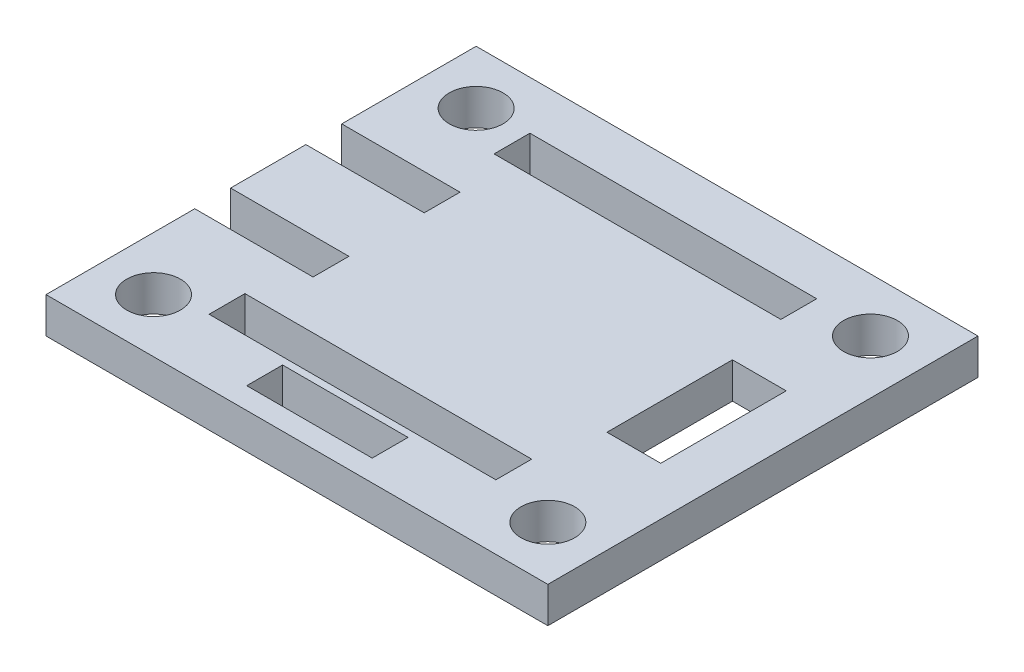
ISO-10303-21;
HEADER;
FILE_DESCRIPTION(('STEP AP214'),'2;1');
FILE_NAME('part.step','',(''),(''),'','','');
FILE_SCHEMA(('AUTOMOTIVE_DESIGN { 1 0 10303 214 1 1 1 1 }'));
ENDSEC;
DATA;
#1=APPLICATION_CONTEXT('core data for automotive mechanical design processes');
#2=APPLICATION_PROTOCOL_DEFINITION('international standard','automotive_design',2000,#1);
#3=PRODUCT_CONTEXT('',#1,'mechanical');
#4=PRODUCT('Part','Part','',(#3));
#5=PRODUCT_RELATED_PRODUCT_CATEGORY('part','',(#4));
#6=PRODUCT_DEFINITION_FORMATION('','',#4);
#7=PRODUCT_DEFINITION_CONTEXT('part definition',#1,'design');
#8=PRODUCT_DEFINITION('design','',#6,#7);
#9=PRODUCT_DEFINITION_SHAPE('','',#8);
#10=(LENGTH_UNIT() NAMED_UNIT(*) SI_UNIT(.MILLI.,.METRE.));
#11=(NAMED_UNIT(*) PLANE_ANGLE_UNIT() SI_UNIT($,.RADIAN.));
#12=(NAMED_UNIT(*) SI_UNIT($,.STERADIAN.) SOLID_ANGLE_UNIT());
#13=UNCERTAINTY_MEASURE_WITH_UNIT(LENGTH_MEASURE(1.E-05),#10,'distance_accuracy_value','');
#14=(GEOMETRIC_REPRESENTATION_CONTEXT(3) GLOBAL_UNCERTAINTY_ASSIGNED_CONTEXT((#13)) GLOBAL_UNIT_ASSIGNED_CONTEXT((#10,
#11,#12)) REPRESENTATION_CONTEXT('',''));
#15=CARTESIAN_POINT('',(0.,0.,0.));
#16=DIRECTION('',(0.,0.,1.));
#17=DIRECTION('',(1.,0.,0.));
#18=AXIS2_PLACEMENT_3D('',#15,#16,#17);
#19=CARTESIAN_POINT('',(-28.,2.,0.));
#20=DIRECTION('',(1.,0.,0.));
#21=DIRECTION('',(0.,0.,-1.));
#22=AXIS2_PLACEMENT_3D('',#19,#20,#21);
#23=PLANE('',#22);
#24=DIRECTION('',(0.,-1.,0.));
#25=VECTOR('',#24,1.);
#26=CARTESIAN_POINT('',(-28.,2.,7.5));
#27=LINE('',#26,#25);
#28=CARTESIAN_POINT('',(-28.,2.,7.5));
#29=VERTEX_POINT('',#28);
#30=CARTESIAN_POINT('',(-28.,0.,7.5));
#31=VERTEX_POINT('',#30);
#32=EDGE_CURVE('E327',#29,#31,#27,.T.);
#33=ORIENTED_EDGE('',*,*,#32,.F.);
#34=DIRECTION('',(0.,0.,1.));
#35=VECTOR('',#34,1.);
#36=CARTESIAN_POINT('',(-28.,2.,0.));
#37=LINE('',#36,#35);
#38=CARTESIAN_POINT('',(-28.,2.,0.));
#39=VERTEX_POINT('',#38);
#40=EDGE_CURVE('E438',#39,#29,#37,.T.);
#41=ORIENTED_EDGE('',*,*,#40,.F.);
#42=DIRECTION('',(0.,-1.,0.));
#43=VECTOR('',#42,1.);
#44=CARTESIAN_POINT('',(-28.,2.,0.));
#45=LINE('',#44,#43);
#46=CARTESIAN_POINT('',(-28.,0.,0.));
#47=VERTEX_POINT('',#46);
#48=EDGE_CURVE('E11',#39,#47,#45,.T.);
#49=ORIENTED_EDGE('',*,*,#48,.T.);
#50=DIRECTION('',(0.,0.,1.));
#51=VECTOR('',#50,1.);
#52=CARTESIAN_POINT('',(-28.,0.,0.));
#53=LINE('',#52,#51);
#54=EDGE_CURVE('E432',#47,#31,#53,.T.);
#55=ORIENTED_EDGE('',*,*,#54,.T.);
#56=EDGE_LOOP('',(#33,#41,#49,#55));
#57=FACE_BOUND('',#56,.T.);
#58=ADVANCED_FACE('F35',(#57),#23,.F.);
#59=CARTESIAN_POINT('',(-28.,2.,9.5));
#60=VERTEX_POINT('',#59);
#61=CARTESIAN_POINT('',(-28.,2.,13.7));
#62=VERTEX_POINT('',#61);
#63=EDGE_CURVE('E441',#60,#62,#37,.T.);
#64=ORIENTED_EDGE('',*,*,#63,.F.);
#65=DIRECTION('',(0.,-1.,0.));
#66=VECTOR('',#65,1.);
#67=CARTESIAN_POINT('',(-28.,2.,9.5));
#68=LINE('',#67,#66);
#69=CARTESIAN_POINT('',(-28.,0.,9.5));
#70=VERTEX_POINT('',#69);
#71=EDGE_CURVE('E330',#60,#70,#68,.T.);
#72=ORIENTED_EDGE('',*,*,#71,.T.);
#73=CARTESIAN_POINT('',(-28.,0.,13.7));
#74=VERTEX_POINT('',#73);
#75=EDGE_CURVE('E452',#70,#74,#53,.T.);
#76=ORIENTED_EDGE('',*,*,#75,.T.);
#77=DIRECTION('',(0.,-1.,0.));
#78=VECTOR('',#77,1.);
#79=CARTESIAN_POINT('',(-28.,2.,13.7));
#80=LINE('',#79,#78);
#81=EDGE_CURVE('E388',#62,#74,#80,.T.);
#82=ORIENTED_EDGE('',*,*,#81,.F.);
#83=EDGE_LOOP('',(#64,#72,#76,#82));
#84=FACE_BOUND('',#83,.T.);
#85=ADVANCED_FACE('F488',(#84),#23,.F.);
#86=CARTESIAN_POINT('',(0.,2.,0.));
#87=DIRECTION('',(0.,-1.,0.));
#88=DIRECTION('',(0.,0.,-1.));
#89=AXIS2_PLACEMENT_3D('',#86,#87,#88);
#90=PLANE('',#89);
#91=DIRECTION('',(-1.,0.,0.));
#92=VECTOR('',#91,1.);
#93=CARTESIAN_POINT('',(-21.4,2.,7.5));
#94=LINE('',#93,#92);
#95=CARTESIAN_POINT('',(-21.4,2.,7.5));
#96=VERTEX_POINT('',#95);
#97=EDGE_CURVE('E349',#96,#29,#94,.T.);
#98=ORIENTED_EDGE('',*,*,#97,.F.);
#99=DIRECTION('',(0.,0.,-1.));
#100=VECTOR('',#99,1.);
#101=CARTESIAN_POINT('',(-21.4,2.,9.5));
#102=LINE('',#101,#100);
#103=CARTESIAN_POINT('',(-21.4,2.,9.5));
#104=VERTEX_POINT('',#103);
#105=EDGE_CURVE('E340',#104,#96,#102,.T.);
#106=ORIENTED_EDGE('',*,*,#105,.F.);
#107=DIRECTION('',(-1.,0.,0.));
#108=VECTOR('',#107,1.);
#109=CARTESIAN_POINT('',(-21.4,2.,9.5));
#110=LINE('',#109,#108);
#111=EDGE_CURVE('E336',#104,#60,#110,.T.);
#112=ORIENTED_EDGE('',*,*,#111,.T.);
#113=ORIENTED_EDGE('',*,*,#63,.T.);
#114=DIRECTION('',(-1.,0.,0.));
#115=VECTOR('',#114,1.);
#116=CARTESIAN_POINT('',(-21.4,2.,13.7));
#117=LINE('',#116,#115);
#118=CARTESIAN_POINT('',(-21.4,2.,13.7));
#119=VERTEX_POINT('',#118);
#120=EDGE_CURVE('E407',#119,#62,#117,.T.);
#121=ORIENTED_EDGE('',*,*,#120,.F.);
#122=DIRECTION('',(0.,0.,-1.));
#123=VECTOR('',#122,1.);
#124=CARTESIAN_POINT('',(-21.4,2.,15.7));
#125=LINE('',#124,#123);
#126=CARTESIAN_POINT('',(-21.4,2.,15.7));
#127=VERTEX_POINT('',#126);
#128=EDGE_CURVE('E400',#127,#119,#125,.T.);
#129=ORIENTED_EDGE('',*,*,#128,.F.);
#130=DIRECTION('',(-1.,0.,0.));
#131=VECTOR('',#130,1.);
#132=CARTESIAN_POINT('',(-21.4,2.,15.7));
#133=LINE('',#132,#131);
#134=CARTESIAN_POINT('',(-28.,2.,15.7));
#135=VERTEX_POINT('',#134);
#136=EDGE_CURVE('E396',#127,#135,#133,.T.);
#137=ORIENTED_EDGE('',*,*,#136,.T.);
#138=CARTESIAN_POINT('',(-28.,2.,24.));
#139=VERTEX_POINT('',#138);
#140=EDGE_CURVE('E437',#135,#139,#37,.T.);
#141=ORIENTED_EDGE('',*,*,#140,.T.);
#142=DIRECTION('',(1.,0.,0.));
#143=VECTOR('',#142,1.);
#144=CARTESIAN_POINT('',(-28.,2.,24.));
#145=LINE('',#144,#143);
#146=CARTESIAN_POINT('',(0.,2.,24.));
#147=VERTEX_POINT('',#146);
#148=EDGE_CURVE('E435',#139,#147,#145,.T.);
#149=ORIENTED_EDGE('',*,*,#148,.T.);
#150=DIRECTION('',(0.,0.,1.));
#151=VECTOR('',#150,1.);
#152=CARTESIAN_POINT('',(0.,2.,0.));
#153=LINE('',#152,#151);
#154=CARTESIAN_POINT('',(0.,2.,0.));
#155=VERTEX_POINT('',#154);
#156=EDGE_CURVE('E431',#155,#147,#153,.T.);
#157=ORIENTED_EDGE('',*,*,#156,.F.);
#158=DIRECTION('',(1.,0.,0.));
#159=VECTOR('',#158,1.);
#160=CARTESIAN_POINT('',(-28.,2.,0.));
#161=LINE('',#160,#159);
#162=EDGE_CURVE('E428',#39,#155,#161,.T.);
#163=ORIENTED_EDGE('',*,*,#162,.F.);
#164=ORIENTED_EDGE('',*,*,#40,.T.);
#165=EDGE_LOOP('',(#98,#106,#112,#113,#121,#129,#137,#141,#149,#157,#163,#164));
#166=FACE_BOUND('',#165,.T.);
#167=DIRECTION('',(1.,0.,0.));
#168=VECTOR('',#167,1.);
#169=CARTESIAN_POINT('',(-5.7,2.,15.));
#170=LINE('',#169,#168);
#171=CARTESIAN_POINT('',(-5.7,2.,15.));
#172=VERTEX_POINT('',#171);
#173=CARTESIAN_POINT('',(-2.7,2.,15.));
#174=VERTEX_POINT('',#173);
#175=EDGE_CURVE('E281',#172,#174,#170,.T.);
#176=ORIENTED_EDGE('',*,*,#175,.F.);
#177=DIRECTION('',(0.,0.,-1.));
#178=VECTOR('',#177,1.);
#179=CARTESIAN_POINT('',(-5.7,2.,15.));
#180=LINE('',#179,#178);
#181=CARTESIAN_POINT('',(-5.7,2.,8.));
#182=VERTEX_POINT('',#181);
#183=EDGE_CURVE('E276',#172,#182,#180,.T.);
#184=ORIENTED_EDGE('',*,*,#183,.T.);
#185=DIRECTION('',(1.,0.,0.));
#186=VECTOR('',#185,1.);
#187=CARTESIAN_POINT('',(-5.7,2.,8.));
#188=LINE('',#187,#186);
#189=CARTESIAN_POINT('',(-2.7,2.,8.));
#190=VERTEX_POINT('',#189);
#191=EDGE_CURVE('E60',#182,#190,#188,.T.);
#192=ORIENTED_EDGE('',*,*,#191,.T.);
#193=DIRECTION('',(0.,0.,-1.));
#194=VECTOR('',#193,1.);
#195=CARTESIAN_POINT('',(-2.7,2.,15.));
#196=LINE('',#195,#194);
#197=EDGE_CURVE('E294',#174,#190,#196,.T.);
#198=ORIENTED_EDGE('',*,*,#197,.F.);
#199=EDGE_LOOP('',(#176,#184,#192,#198));
#200=FACE_BOUND('',#199,.T.);
#201=CARTESIAN_POINT('',(-3.,2.,21.));
#202=DIRECTION('',(0.,1.,0.));
#203=DIRECTION('',(0.,0.,1.));
#204=AXIS2_PLACEMENT_3D('',#201,#202,#203);
#205=CIRCLE('',#204,1.5);
#206=CARTESIAN_POINT('',(-3.,2.,22.5));
#207=VERTEX_POINT('',#206);
#208=EDGE_CURVE('E414',#207,#207,#205,.T.);
#209=ORIENTED_EDGE('',*,*,#208,.F.);
#210=EDGE_LOOP('',(#209));
#211=FACE_BOUND('',#210,.T.);
#212=CARTESIAN_POINT('',(-25.,2.,3.));
#213=DIRECTION('',(0.,1.,0.));
#214=DIRECTION('',(0.,0.,1.));
#215=AXIS2_PLACEMENT_3D('',#212,#213,#214);
#216=CIRCLE('',#215,1.5);
#217=CARTESIAN_POINT('',(-25.,2.,4.5));
#218=VERTEX_POINT('',#217);
#219=EDGE_CURVE('E381',#218,#218,#216,.T.);
#220=ORIENTED_EDGE('',*,*,#219,.F.);
#221=EDGE_LOOP('',(#220));
#222=FACE_BOUND('',#221,.T.);
#223=CARTESIAN_POINT('',(-3.,2.,3.));
#224=DIRECTION('',(0.,1.,0.));
#225=DIRECTION('',(0.,0.,1.));
#226=AXIS2_PLACEMENT_3D('',#223,#224,#225);
#227=CIRCLE('',#226,1.5);
#228=CARTESIAN_POINT('',(-3.,2.,4.5));
#229=VERTEX_POINT('',#228);
#230=EDGE_CURVE('E382',#229,#229,#227,.T.);
#231=ORIENTED_EDGE('',*,*,#230,.F.);
#232=EDGE_LOOP('',(#231));
#233=FACE_BOUND('',#232,.T.);
#234=CARTESIAN_POINT('',(-25.,2.,21.));
#235=DIRECTION('',(0.,1.,0.));
#236=DIRECTION('',(0.,0.,1.));
#237=AXIS2_PLACEMENT_3D('',#234,#235,#236);
#238=CIRCLE('',#237,1.5);
#239=CARTESIAN_POINT('',(-25.,2.,22.5));
#240=VERTEX_POINT('',#239);
#241=EDGE_CURVE('E422',#240,#240,#238,.T.);
#242=ORIENTED_EDGE('',*,*,#241,.F.);
#243=EDGE_LOOP('',(#242));
#244=FACE_BOUND('',#243,.T.);
#245=DIRECTION('',(1.,0.,0.));
#246=VECTOR('',#245,1.);
#247=CARTESIAN_POINT('',(-22.5,2.,20.4));
#248=LINE('',#247,#246);
#249=CARTESIAN_POINT('',(-22.5,2.,20.4));
#250=VERTEX_POINT('',#249);
#251=CARTESIAN_POINT('',(-6.5,2.,20.4));
#252=VERTEX_POINT('',#251);
#253=EDGE_CURVE('E255',#250,#252,#248,.T.);
#254=ORIENTED_EDGE('',*,*,#253,.F.);
#255=DIRECTION('',(0.,0.,-1.));
#256=VECTOR('',#255,1.);
#257=CARTESIAN_POINT('',(-22.5,2.,20.4));
#258=LINE('',#257,#256);
#259=CARTESIAN_POINT('',(-22.5,2.,18.4));
#260=VERTEX_POINT('',#259);
#261=EDGE_CURVE('E229',#250,#260,#258,.T.);
#262=ORIENTED_EDGE('',*,*,#261,.T.);
#263=DIRECTION('',(1.,0.,0.));
#264=VECTOR('',#263,1.);
#265=CARTESIAN_POINT('',(-22.5,2.,18.4));
#266=LINE('',#265,#264);
#267=CARTESIAN_POINT('',(-6.5,2.,18.4));
#268=VERTEX_POINT('',#267);
#269=EDGE_CURVE('E261',#260,#268,#266,.T.);
#270=ORIENTED_EDGE('',*,*,#269,.T.);
#271=DIRECTION('',(0.,0.,-1.));
#272=VECTOR('',#271,1.);
#273=CARTESIAN_POINT('',(-6.5,2.,20.4));
#274=LINE('',#273,#272);
#275=EDGE_CURVE('E257',#252,#268,#274,.T.);
#276=ORIENTED_EDGE('',*,*,#275,.F.);
#277=EDGE_LOOP('',(#254,#262,#270,#276));
#278=FACE_BOUND('',#277,.T.);
#279=DIRECTION('',(1.,0.,0.));
#280=VECTOR('',#279,1.);
#281=CARTESIAN_POINT('',(-18.,2.,22.8));
#282=LINE('',#281,#280);
#283=CARTESIAN_POINT('',(-18.,2.,22.8));
#284=VERTEX_POINT('',#283);
#285=CARTESIAN_POINT('',(-11.,2.,22.8));
#286=VERTEX_POINT('',#285);
#287=EDGE_CURVE('E300',#284,#286,#282,.T.);
#288=ORIENTED_EDGE('',*,*,#287,.F.);
#289=DIRECTION('',(0.,0.,-1.));
#290=VECTOR('',#289,1.);
#291=CARTESIAN_POINT('',(-18.,2.,22.8));
#292=LINE('',#291,#290);
#293=CARTESIAN_POINT('',(-18.,2.,20.8));
#294=VERTEX_POINT('',#293);
#295=EDGE_CURVE('E308',#284,#294,#292,.T.);
#296=ORIENTED_EDGE('',*,*,#295,.T.);
#297=DIRECTION('',(1.,0.,0.));
#298=VECTOR('',#297,1.);
#299=CARTESIAN_POINT('',(-18.,2.,20.8));
#300=LINE('',#299,#298);
#301=CARTESIAN_POINT('',(-11.,2.,20.8));
#302=VERTEX_POINT('',#301);
#303=EDGE_CURVE('E319',#294,#302,#300,.T.);
#304=ORIENTED_EDGE('',*,*,#303,.T.);
#305=DIRECTION('',(0.,0.,-1.));
#306=VECTOR('',#305,1.);
#307=CARTESIAN_POINT('',(-11.,2.,22.8));
#308=LINE('',#307,#306);
#309=EDGE_CURVE('E316',#286,#302,#308,.T.);
#310=ORIENTED_EDGE('',*,*,#309,.F.);
#311=EDGE_LOOP('',(#288,#296,#304,#310));
#312=FACE_BOUND('',#311,.T.);
#313=DIRECTION('',(1.,0.,0.));
#314=VECTOR('',#313,1.);
#315=CARTESIAN_POINT('',(-22.3,2.,4.7));
#316=LINE('',#315,#314);
#317=CARTESIAN_POINT('',(-22.3,2.,4.7));
#318=VERTEX_POINT('',#317);
#319=CARTESIAN_POINT('',(-6.3,2.,4.7));
#320=VERTEX_POINT('',#319);
#321=EDGE_CURVE('E355',#318,#320,#316,.T.);
#322=ORIENTED_EDGE('',*,*,#321,.F.);
#323=DIRECTION('',(0.,0.,-1.));
#324=VECTOR('',#323,1.);
#325=CARTESIAN_POINT('',(-22.3,2.,4.7));
#326=LINE('',#325,#324);
#327=CARTESIAN_POINT('',(-22.3,2.,2.7));
#328=VERTEX_POINT('',#327);
#329=EDGE_CURVE('E364',#318,#328,#326,.T.);
#330=ORIENTED_EDGE('',*,*,#329,.T.);
#331=DIRECTION('',(1.,0.,0.));
#332=VECTOR('',#331,1.);
#333=CARTESIAN_POINT('',(-22.3,2.,2.7));
#334=LINE('',#333,#332);
#335=CARTESIAN_POINT('',(-6.3,2.,2.7));
#336=VERTEX_POINT('',#335);
#337=EDGE_CURVE('E373',#328,#336,#334,.T.);
#338=ORIENTED_EDGE('',*,*,#337,.T.);
#339=DIRECTION('',(0.,0.,-1.));
#340=VECTOR('',#339,1.);
#341=CARTESIAN_POINT('',(-6.3,2.,4.7));
#342=LINE('',#341,#340);
#343=EDGE_CURVE('E371',#320,#336,#342,.T.);
#344=ORIENTED_EDGE('',*,*,#343,.F.);
#345=EDGE_LOOP('',(#322,#330,#338,#344));
#346=FACE_BOUND('',#345,.T.);
#347=ADVANCED_FACE('F473',(#166,#200,#211,#222,#233,#244,#278,#312,#346),#90,.F.);
#348=CARTESIAN_POINT('',(0.,0.,0.));
#349=DIRECTION('',(0.,-1.,0.));
#350=DIRECTION('',(0.,0.,-1.));
#351=AXIS2_PLACEMENT_3D('',#348,#349,#350);
#352=PLANE('',#351);
#353=DIRECTION('',(0.,0.,-1.));
#354=VECTOR('',#353,1.);
#355=CARTESIAN_POINT('',(-18.,0.,22.8));
#356=LINE('',#355,#354);
#357=CARTESIAN_POINT('',(-18.,0.,22.8));
#358=VERTEX_POINT('',#357);
#359=CARTESIAN_POINT('',(-18.,0.,20.8));
#360=VERTEX_POINT('',#359);
#361=EDGE_CURVE('E269',#358,#360,#356,.T.);
#362=ORIENTED_EDGE('',*,*,#361,.F.);
#363=DIRECTION('',(1.,0.,0.));
#364=VECTOR('',#363,1.);
#365=CARTESIAN_POINT('',(-18.,0.,22.8));
#366=LINE('',#365,#364);
#367=CARTESIAN_POINT('',(-11.,0.,22.8));
#368=VERTEX_POINT('',#367);
#369=EDGE_CURVE('E304',#358,#368,#366,.T.);
#370=ORIENTED_EDGE('',*,*,#369,.T.);
#371=DIRECTION('',(0.,0.,-1.));
#372=VECTOR('',#371,1.);
#373=CARTESIAN_POINT('',(-11.,0.,22.8));
#374=LINE('',#373,#372);
#375=CARTESIAN_POINT('',(-11.,0.,20.8));
#376=VERTEX_POINT('',#375);
#377=EDGE_CURVE('E307',#368,#376,#374,.T.);
#378=ORIENTED_EDGE('',*,*,#377,.T.);
#379=DIRECTION('',(1.,0.,0.));
#380=VECTOR('',#379,1.);
#381=CARTESIAN_POINT('',(-18.,0.,20.8));
#382=LINE('',#381,#380);
#383=EDGE_CURVE('E311',#360,#376,#382,.T.);
#384=ORIENTED_EDGE('',*,*,#383,.F.);
#385=EDGE_LOOP('',(#362,#370,#378,#384));
#386=FACE_BOUND('',#385,.T.);
#387=CARTESIAN_POINT('',(-3.,0.,21.));
#388=DIRECTION('',(0.,1.,0.));
#389=DIRECTION('',(0.,0.,1.));
#390=AXIS2_PLACEMENT_3D('',#387,#388,#389);
#391=CIRCLE('',#390,1.5);
#392=CARTESIAN_POINT('',(-3.,0.,22.5));
#393=VERTEX_POINT('',#392);
#394=EDGE_CURVE('E410',#393,#393,#391,.T.);
#395=ORIENTED_EDGE('',*,*,#394,.T.);
#396=EDGE_LOOP('',(#395));
#397=FACE_BOUND('',#396,.T.);
#398=CARTESIAN_POINT('',(-25.,0.,3.));
#399=DIRECTION('',(0.,1.,0.));
#400=DIRECTION('',(0.,0.,1.));
#401=AXIS2_PLACEMENT_3D('',#398,#399,#400);
#402=CIRCLE('',#401,1.5);
#403=CARTESIAN_POINT('',(-25.,0.,4.5));
#404=VERTEX_POINT('',#403);
#405=EDGE_CURVE('E417',#404,#404,#402,.T.);
#406=ORIENTED_EDGE('',*,*,#405,.T.);
#407=EDGE_LOOP('',(#406));
#408=FACE_BOUND('',#407,.T.);
#409=CARTESIAN_POINT('',(-3.,0.,3.));
#410=DIRECTION('',(0.,1.,0.));
#411=DIRECTION('',(0.,0.,1.));
#412=AXIS2_PLACEMENT_3D('',#409,#410,#411);
#413=CIRCLE('',#412,1.5);
#414=CARTESIAN_POINT('',(-3.,0.,4.5));
#415=VERTEX_POINT('',#414);
#416=EDGE_CURVE('E378',#415,#415,#413,.T.);
#417=ORIENTED_EDGE('',*,*,#416,.T.);
#418=EDGE_LOOP('',(#417));
#419=FACE_BOUND('',#418,.T.);
#420=DIRECTION('',(0.,0.,-1.));
#421=VECTOR('',#420,1.);
#422=CARTESIAN_POINT('',(-21.4,0.,9.5));
#423=LINE('',#422,#421);
#424=CARTESIAN_POINT('',(-21.4,0.,9.5));
#425=VERTEX_POINT('',#424);
#426=CARTESIAN_POINT('',(-21.4,0.,7.5));
#427=VERTEX_POINT('',#426);
#428=EDGE_CURVE('E343',#425,#427,#423,.T.);
#429=ORIENTED_EDGE('',*,*,#428,.T.);
#430=DIRECTION('',(-1.,0.,0.));
#431=VECTOR('',#430,1.);
#432=CARTESIAN_POINT('',(-21.4,0.,7.5));
#433=LINE('',#432,#431);
#434=EDGE_CURVE('E339',#427,#31,#433,.T.);
#435=ORIENTED_EDGE('',*,*,#434,.T.);
#436=ORIENTED_EDGE('',*,*,#54,.F.);
#437=DIRECTION('',(1.,0.,0.));
#438=VECTOR('',#437,1.);
#439=CARTESIAN_POINT('',(-28.,0.,0.));
#440=LINE('',#439,#438);
#441=CARTESIAN_POINT('',(0.,0.,0.));
#442=VERTEX_POINT('',#441);
#443=EDGE_CURVE('E425',#47,#442,#440,.T.);
#444=ORIENTED_EDGE('',*,*,#443,.T.);
#445=DIRECTION('',(0.,0.,1.));
#446=VECTOR('',#445,1.);
#447=CARTESIAN_POINT('',(0.,0.,0.));
#448=LINE('',#447,#446);
#449=CARTESIAN_POINT('',(0.,0.,24.));
#450=VERTEX_POINT('',#449);
#451=EDGE_CURVE('E444',#442,#450,#448,.T.);
#452=ORIENTED_EDGE('',*,*,#451,.T.);
#453=DIRECTION('',(1.,0.,0.));
#454=VECTOR('',#453,1.);
#455=CARTESIAN_POINT('',(-28.,0.,24.));
#456=LINE('',#455,#454);
#457=CARTESIAN_POINT('',(-28.,0.,24.));
#458=VERTEX_POINT('',#457);
#459=EDGE_CURVE('E447',#458,#450,#456,.T.);
#460=ORIENTED_EDGE('',*,*,#459,.F.);
#461=CARTESIAN_POINT('',(-28.,0.,15.7));
#462=VERTEX_POINT('',#461);
#463=EDGE_CURVE('E450',#462,#458,#53,.T.);
#464=ORIENTED_EDGE('',*,*,#463,.F.);
#465=DIRECTION('',(-1.,0.,0.));
#466=VECTOR('',#465,1.);
#467=CARTESIAN_POINT('',(-21.4,0.,15.7));
#468=LINE('',#467,#466);
#469=CARTESIAN_POINT('',(-21.4,0.,15.7));
#470=VERTEX_POINT('',#469);
#471=EDGE_CURVE('E397',#470,#462,#468,.T.);
#472=ORIENTED_EDGE('',*,*,#471,.F.);
#473=DIRECTION('',(0.,0.,-1.));
#474=VECTOR('',#473,1.);
#475=CARTESIAN_POINT('',(-21.4,0.,15.7));
#476=LINE('',#475,#474);
#477=CARTESIAN_POINT('',(-21.4,0.,13.7));
#478=VERTEX_POINT('',#477);
#479=EDGE_CURVE('E385',#470,#478,#476,.T.);
#480=ORIENTED_EDGE('',*,*,#479,.T.);
#481=DIRECTION('',(-1.,0.,0.));
#482=VECTOR('',#481,1.);
#483=CARTESIAN_POINT('',(-21.4,0.,13.7));
#484=LINE('',#483,#482);
#485=EDGE_CURVE('E399',#478,#74,#484,.T.);
#486=ORIENTED_EDGE('',*,*,#485,.T.);
#487=ORIENTED_EDGE('',*,*,#75,.F.);
#488=DIRECTION('',(-1.,0.,0.));
#489=VECTOR('',#488,1.);
#490=CARTESIAN_POINT('',(-21.4,0.,9.5));
#491=LINE('',#490,#489);
#492=EDGE_CURVE('E337',#425,#70,#491,.T.);
#493=ORIENTED_EDGE('',*,*,#492,.F.);
#494=EDGE_LOOP('',(#429,#435,#436,#444,#452,#460,#464,#472,#480,#486,#487,#493));
#495=FACE_BOUND('',#494,.T.);
#496=CARTESIAN_POINT('',(-25.,0.,21.));
#497=DIRECTION('',(0.,1.,0.));
#498=DIRECTION('',(0.,0.,1.));
#499=AXIS2_PLACEMENT_3D('',#496,#497,#498);
#500=CIRCLE('',#499,1.5);
#501=CARTESIAN_POINT('',(-25.,0.,22.5));
#502=VERTEX_POINT('',#501);
#503=EDGE_CURVE('E413',#502,#502,#500,.T.);
#504=ORIENTED_EDGE('',*,*,#503,.T.);
#505=EDGE_LOOP('',(#504));
#506=FACE_BOUND('',#505,.T.);
#507=DIRECTION('',(0.,0.,-1.));
#508=VECTOR('',#507,1.);
#509=CARTESIAN_POINT('',(-22.5,0.,20.4));
#510=LINE('',#509,#508);
#511=CARTESIAN_POINT('',(-22.5,0.,20.4));
#512=VERTEX_POINT('',#511);
#513=CARTESIAN_POINT('',(-22.5,0.,18.4));
#514=VERTEX_POINT('',#513);
#515=EDGE_CURVE('E226',#512,#514,#510,.T.);
#516=ORIENTED_EDGE('',*,*,#515,.F.);
#517=DIRECTION('',(1.,0.,0.));
#518=VECTOR('',#517,1.);
#519=CARTESIAN_POINT('',(-22.5,0.,20.4));
#520=LINE('',#519,#518);
#521=CARTESIAN_POINT('',(-6.5,0.,20.4));
#522=VERTEX_POINT('',#521);
#523=EDGE_CURVE('E235',#512,#522,#520,.T.);
#524=ORIENTED_EDGE('',*,*,#523,.T.);
#525=DIRECTION('',(0.,0.,-1.));
#526=VECTOR('',#525,1.);
#527=CARTESIAN_POINT('',(-6.5,0.,20.4));
#528=LINE('',#527,#526);
#529=CARTESIAN_POINT('',(-6.5,0.,18.4));
#530=VERTEX_POINT('',#529);
#531=EDGE_CURVE('E241',#522,#530,#528,.T.);
#532=ORIENTED_EDGE('',*,*,#531,.T.);
#533=DIRECTION('',(1.,0.,0.));
#534=VECTOR('',#533,1.);
#535=CARTESIAN_POINT('',(-22.5,0.,18.4));
#536=LINE('',#535,#534);
#537=EDGE_CURVE('E247',#514,#530,#536,.T.);
#538=ORIENTED_EDGE('',*,*,#537,.F.);
#539=EDGE_LOOP('',(#516,#524,#532,#538));
#540=FACE_BOUND('',#539,.T.);
#541=DIRECTION('',(0.,0.,-1.));
#542=VECTOR('',#541,1.);
#543=CARTESIAN_POINT('',(-5.7,0.,15.));
#544=LINE('',#543,#542);
#545=CARTESIAN_POINT('',(-5.7,0.,15.));
#546=VERTEX_POINT('',#545);
#547=CARTESIAN_POINT('',(-5.7,0.,8.));
#548=VERTEX_POINT('',#547);
#549=EDGE_CURVE('E277',#546,#548,#544,.T.);
#550=ORIENTED_EDGE('',*,*,#549,.F.);
#551=DIRECTION('',(1.,0.,0.));
#552=VECTOR('',#551,1.);
#553=CARTESIAN_POINT('',(-5.7,0.,15.));
#554=LINE('',#553,#552);
#555=CARTESIAN_POINT('',(-2.7,0.,15.));
#556=VERTEX_POINT('',#555);
#557=EDGE_CURVE('E287',#546,#556,#554,.T.);
#558=ORIENTED_EDGE('',*,*,#557,.T.);
#559=DIRECTION('',(0.,0.,-1.));
#560=VECTOR('',#559,1.);
#561=CARTESIAN_POINT('',(-2.7,0.,15.));
#562=LINE('',#561,#560);
#563=CARTESIAN_POINT('',(-2.7,0.,8.));
#564=VERTEX_POINT('',#563);
#565=EDGE_CURVE('E284',#556,#564,#562,.T.);
#566=ORIENTED_EDGE('',*,*,#565,.T.);
#567=DIRECTION('',(1.,0.,0.));
#568=VECTOR('',#567,1.);
#569=CARTESIAN_POINT('',(-5.7,0.,8.));
#570=LINE('',#569,#568);
#571=EDGE_CURVE('E280',#548,#564,#570,.T.);
#572=ORIENTED_EDGE('',*,*,#571,.F.);
#573=EDGE_LOOP('',(#550,#558,#566,#572));
#574=FACE_BOUND('',#573,.T.);
#575=DIRECTION('',(0.,0.,-1.));
#576=VECTOR('',#575,1.);
#577=CARTESIAN_POINT('',(-22.3,0.,4.7));
#578=LINE('',#577,#576);
#579=CARTESIAN_POINT('',(-22.3,0.,4.7));
#580=VERTEX_POINT('',#579);
#581=CARTESIAN_POINT('',(-22.3,0.,2.7));
#582=VERTEX_POINT('',#581);
#583=EDGE_CURVE('E328',#580,#582,#578,.T.);
#584=ORIENTED_EDGE('',*,*,#583,.F.);
#585=DIRECTION('',(1.,0.,0.));
#586=VECTOR('',#585,1.);
#587=CARTESIAN_POINT('',(-22.3,0.,4.7));
#588=LINE('',#587,#586);
#589=CARTESIAN_POINT('',(-6.3,0.,4.7));
#590=VERTEX_POINT('',#589);
#591=EDGE_CURVE('E360',#580,#590,#588,.T.);
#592=ORIENTED_EDGE('',*,*,#591,.T.);
#593=DIRECTION('',(0.,0.,-1.));
#594=VECTOR('',#593,1.);
#595=CARTESIAN_POINT('',(-6.3,0.,4.7));
#596=LINE('',#595,#594);
#597=CARTESIAN_POINT('',(-6.3,0.,2.7));
#598=VERTEX_POINT('',#597);
#599=EDGE_CURVE('E363',#590,#598,#596,.T.);
#600=ORIENTED_EDGE('',*,*,#599,.T.);
#601=DIRECTION('',(1.,0.,0.));
#602=VECTOR('',#601,1.);
#603=CARTESIAN_POINT('',(-22.3,0.,2.7));
#604=LINE('',#603,#602);
#605=EDGE_CURVE('E367',#582,#598,#604,.T.);
#606=ORIENTED_EDGE('',*,*,#605,.F.);
#607=EDGE_LOOP('',(#584,#592,#600,#606));
#608=FACE_BOUND('',#607,.T.);
#609=ADVANCED_FACE('F244',(#386,#397,#408,#419,#495,#506,#540,#574,#608),#352,.T.);
#610=CARTESIAN_POINT('',(-28.,2.,0.));
#611=DIRECTION('',(0.,0.,-1.));
#612=DIRECTION('',(-1.,0.,0.));
#613=AXIS2_PLACEMENT_3D('',#610,#611,#612);
#614=PLANE('',#613);
#615=ORIENTED_EDGE('',*,*,#443,.F.);
#616=ORIENTED_EDGE('',*,*,#48,.F.);
#617=ORIENTED_EDGE('',*,*,#162,.T.);
#618=DIRECTION('',(0.,-1.,0.));
#619=VECTOR('',#618,1.);
#620=CARTESIAN_POINT('',(0.,2.,0.));
#621=LINE('',#620,#619);
#622=EDGE_CURVE('E39',#155,#442,#621,.T.);
#623=ORIENTED_EDGE('',*,*,#622,.T.);
#624=EDGE_LOOP('',(#615,#616,#617,#623));
#625=FACE_BOUND('',#624,.T.);
#626=ADVANCED_FACE('F37',(#625),#614,.T.);
#627=ORIENTED_EDGE('',*,*,#140,.F.);
#628=DIRECTION('',(0.,-1.,0.));
#629=VECTOR('',#628,1.);
#630=CARTESIAN_POINT('',(-28.,2.,15.7));
#631=LINE('',#630,#629);
#632=EDGE_CURVE('E390',#135,#462,#631,.T.);
#633=ORIENTED_EDGE('',*,*,#632,.T.);
#634=ORIENTED_EDGE('',*,*,#463,.T.);
#635=DIRECTION('',(0.,-1.,0.));
#636=VECTOR('',#635,1.);
#637=CARTESIAN_POINT('',(-28.,2.,24.));
#638=LINE('',#637,#636);
#639=EDGE_CURVE('E44',#139,#458,#638,.T.);
#640=ORIENTED_EDGE('',*,*,#639,.F.);
#641=EDGE_LOOP('',(#627,#633,#634,#640));
#642=FACE_BOUND('',#641,.T.);
#643=ADVANCED_FACE('F519',(#642),#23,.F.);
#644=CARTESIAN_POINT('',(-28.,2.,24.));
#645=DIRECTION('',(0.,0.,-1.));
#646=DIRECTION('',(-1.,0.,0.));
#647=AXIS2_PLACEMENT_3D('',#644,#645,#646);
#648=PLANE('',#647);
#649=ORIENTED_EDGE('',*,*,#459,.T.);
#650=DIRECTION('',(0.,-1.,0.));
#651=VECTOR('',#650,1.);
#652=CARTESIAN_POINT('',(0.,2.,24.));
#653=LINE('',#652,#651);
#654=EDGE_CURVE('E455',#147,#450,#653,.T.);
#655=ORIENTED_EDGE('',*,*,#654,.F.);
#656=ORIENTED_EDGE('',*,*,#148,.F.);
#657=ORIENTED_EDGE('',*,*,#639,.T.);
#658=EDGE_LOOP('',(#649,#655,#656,#657));
#659=FACE_BOUND('',#658,.T.);
#660=ADVANCED_FACE('F479',(#659),#648,.F.);
#661=CARTESIAN_POINT('',(0.,2.,0.));
#662=DIRECTION('',(1.,0.,0.));
#663=DIRECTION('',(0.,0.,-1.));
#664=AXIS2_PLACEMENT_3D('',#661,#662,#663);
#665=PLANE('',#664);
#666=ORIENTED_EDGE('',*,*,#451,.F.);
#667=ORIENTED_EDGE('',*,*,#622,.F.);
#668=ORIENTED_EDGE('',*,*,#156,.T.);
#669=ORIENTED_EDGE('',*,*,#654,.T.);
#670=EDGE_LOOP('',(#666,#667,#668,#669));
#671=FACE_BOUND('',#670,.T.);
#672=ADVANCED_FACE('F463',(#671),#665,.T.);
#673=CARTESIAN_POINT('',(-25.,2.,21.));
#674=DIRECTION('',(0.,-1.,0.));
#675=DIRECTION('',(0.,0.,-1.));
#676=AXIS2_PLACEMENT_3D('',#673,#674,#675);
#677=CYLINDRICAL_SURFACE('',#676,1.5);
#678=ORIENTED_EDGE('',*,*,#241,.T.);
#679=EDGE_LOOP('',(#678));
#680=FACE_BOUND('',#679,.T.);
#681=ORIENTED_EDGE('',*,*,#503,.F.);
#682=EDGE_LOOP('',(#681));
#683=FACE_BOUND('',#682,.T.);
#684=ADVANCED_FACE('F553',(#680,#683),#677,.F.);
#685=CARTESIAN_POINT('',(-22.5,2.,20.4));
#686=DIRECTION('',(-1.,0.,0.));
#687=DIRECTION('',(0.,0.,1.));
#688=AXIS2_PLACEMENT_3D('',#685,#686,#687);
#689=PLANE('',#688);
#690=ORIENTED_EDGE('',*,*,#515,.T.);
#691=DIRECTION('',(0.,-1.,0.));
#692=VECTOR('',#691,1.);
#693=CARTESIAN_POINT('',(-22.5,2.,18.4));
#694=LINE('',#693,#692);
#695=EDGE_CURVE('E258',#260,#514,#694,.T.);
#696=ORIENTED_EDGE('',*,*,#695,.F.);
#697=ORIENTED_EDGE('',*,*,#261,.F.);
#698=DIRECTION('',(0.,-1.,0.));
#699=VECTOR('',#698,1.);
#700=CARTESIAN_POINT('',(-22.5,2.,20.4));
#701=LINE('',#700,#699);
#702=EDGE_CURVE('E222',#250,#512,#701,.T.);
#703=ORIENTED_EDGE('',*,*,#702,.T.);
#704=EDGE_LOOP('',(#690,#696,#697,#703));
#705=FACE_BOUND('',#704,.T.);
#706=ADVANCED_FACE('F224',(#705),#689,.F.);
#707=CARTESIAN_POINT('',(-22.5,2.,20.4));
#708=DIRECTION('',(0.,0.,-1.));
#709=DIRECTION('',(-1.,0.,0.));
#710=AXIS2_PLACEMENT_3D('',#707,#708,#709);
#711=PLANE('',#710);
#712=ORIENTED_EDGE('',*,*,#523,.F.);
#713=ORIENTED_EDGE('',*,*,#702,.F.);
#714=ORIENTED_EDGE('',*,*,#253,.T.);
#715=DIRECTION('',(0.,-1.,0.));
#716=VECTOR('',#715,1.);
#717=CARTESIAN_POINT('',(-6.5,2.,20.4));
#718=LINE('',#717,#716);
#719=EDGE_CURVE('E232',#252,#522,#718,.T.);
#720=ORIENTED_EDGE('',*,*,#719,.T.);
#721=EDGE_LOOP('',(#712,#713,#714,#720));
#722=FACE_BOUND('',#721,.T.);
#723=ADVANCED_FACE('F236',(#722),#711,.T.);
#724=CARTESIAN_POINT('',(-6.5,2.,20.4));
#725=DIRECTION('',(-1.,0.,0.));
#726=DIRECTION('',(0.,0.,1.));
#727=AXIS2_PLACEMENT_3D('',#724,#725,#726);
#728=PLANE('',#727);
#729=ORIENTED_EDGE('',*,*,#531,.F.);
#730=ORIENTED_EDGE('',*,*,#719,.F.);
#731=ORIENTED_EDGE('',*,*,#275,.T.);
#732=DIRECTION('',(0.,-1.,0.));
#733=VECTOR('',#732,1.);
#734=CARTESIAN_POINT('',(-6.5,2.,18.4));
#735=LINE('',#734,#733);
#736=EDGE_CURVE('E844',#268,#530,#735,.T.);
#737=ORIENTED_EDGE('',*,*,#736,.T.);
#738=EDGE_LOOP('',(#729,#730,#731,#737));
#739=FACE_BOUND('',#738,.T.);
#740=ADVANCED_FACE('F618',(#739),#728,.T.);
#741=CARTESIAN_POINT('',(-22.5,2.,18.4));
#742=DIRECTION('',(0.,0.,-1.));
#743=DIRECTION('',(-1.,0.,0.));
#744=AXIS2_PLACEMENT_3D('',#741,#742,#743);
#745=PLANE('',#744);
#746=ORIENTED_EDGE('',*,*,#537,.T.);
#747=ORIENTED_EDGE('',*,*,#736,.F.);
#748=ORIENTED_EDGE('',*,*,#269,.F.);
#749=ORIENTED_EDGE('',*,*,#695,.T.);
#750=EDGE_LOOP('',(#746,#747,#748,#749));
#751=FACE_BOUND('',#750,.T.);
#752=ADVANCED_FACE('F621',(#751),#745,.F.);
#753=CARTESIAN_POINT('',(-21.4,2.,15.7));
#754=DIRECTION('',(-1.,0.,0.));
#755=DIRECTION('',(0.,0.,1.));
#756=AXIS2_PLACEMENT_3D('',#753,#754,#755);
#757=PLANE('',#756);
#758=ORIENTED_EDGE('',*,*,#479,.F.);
#759=DIRECTION('',(0.,-1.,0.));
#760=VECTOR('',#759,1.);
#761=CARTESIAN_POINT('',(-21.4,2.,15.7));
#762=LINE('',#761,#760);
#763=EDGE_CURVE('E393',#127,#470,#762,.T.);
#764=ORIENTED_EDGE('',*,*,#763,.F.);
#765=ORIENTED_EDGE('',*,*,#128,.T.);
#766=DIRECTION('',(0.,-1.,0.));
#767=VECTOR('',#766,1.);
#768=CARTESIAN_POINT('',(-21.4,2.,13.7));
#769=LINE('',#768,#767);
#770=EDGE_CURVE('E346',#119,#478,#769,.T.);
#771=ORIENTED_EDGE('',*,*,#770,.T.);
#772=EDGE_LOOP('',(#758,#764,#765,#771));
#773=FACE_BOUND('',#772,.T.);
#774=ADVANCED_FACE('F496',(#773),#757,.T.);
#775=CARTESIAN_POINT('',(-21.4,2.,13.7));
#776=DIRECTION('',(0.,0.,1.));
#777=DIRECTION('',(1.,0.,0.));
#778=AXIS2_PLACEMENT_3D('',#775,#776,#777);
#779=PLANE('',#778);
#780=ORIENTED_EDGE('',*,*,#485,.F.);
#781=ORIENTED_EDGE('',*,*,#770,.F.);
#782=ORIENTED_EDGE('',*,*,#120,.T.);
#783=ORIENTED_EDGE('',*,*,#81,.T.);
#784=EDGE_LOOP('',(#780,#781,#782,#783));
#785=FACE_BOUND('',#784,.T.);
#786=ADVANCED_FACE('F493',(#785),#779,.T.);
#787=CARTESIAN_POINT('',(-21.4,2.,15.7));
#788=DIRECTION('',(0.,0.,1.));
#789=DIRECTION('',(1.,0.,0.));
#790=AXIS2_PLACEMENT_3D('',#787,#788,#789);
#791=PLANE('',#790);
#792=ORIENTED_EDGE('',*,*,#471,.T.);
#793=ORIENTED_EDGE('',*,*,#632,.F.);
#794=ORIENTED_EDGE('',*,*,#136,.F.);
#795=ORIENTED_EDGE('',*,*,#763,.T.);
#796=EDGE_LOOP('',(#792,#793,#794,#795));
#797=FACE_BOUND('',#796,.T.);
#798=ADVANCED_FACE('F531',(#797),#791,.F.);
#799=CARTESIAN_POINT('',(-3.,2.,3.));
#800=DIRECTION('',(0.,-1.,0.));
#801=DIRECTION('',(0.,0.,-1.));
#802=AXIS2_PLACEMENT_3D('',#799,#800,#801);
#803=CYLINDRICAL_SURFACE('',#802,1.5);
#804=ORIENTED_EDGE('',*,*,#230,.T.);
#805=EDGE_LOOP('',(#804));
#806=FACE_BOUND('',#805,.T.);
#807=ORIENTED_EDGE('',*,*,#416,.F.);
#808=EDGE_LOOP('',(#807));
#809=FACE_BOUND('',#808,.T.);
#810=ADVANCED_FACE('F533',(#806,#809),#803,.F.);
#811=CARTESIAN_POINT('',(-25.,2.,3.));
#812=DIRECTION('',(0.,-1.,0.));
#813=DIRECTION('',(0.,0.,-1.));
#814=AXIS2_PLACEMENT_3D('',#811,#812,#813);
#815=CYLINDRICAL_SURFACE('',#814,1.5);
#816=ORIENTED_EDGE('',*,*,#219,.T.);
#817=EDGE_LOOP('',(#816));
#818=FACE_BOUND('',#817,.T.);
#819=ORIENTED_EDGE('',*,*,#405,.F.);
#820=EDGE_LOOP('',(#819));
#821=FACE_BOUND('',#820,.T.);
#822=ADVANCED_FACE('F539',(#818,#821),#815,.F.);
#823=CARTESIAN_POINT('',(-3.,2.,21.));
#824=DIRECTION('',(0.,-1.,0.));
#825=DIRECTION('',(0.,0.,-1.));
#826=AXIS2_PLACEMENT_3D('',#823,#824,#825);
#827=CYLINDRICAL_SURFACE('',#826,1.5);
#828=ORIENTED_EDGE('',*,*,#208,.T.);
#829=EDGE_LOOP('',(#828));
#830=FACE_BOUND('',#829,.T.);
#831=ORIENTED_EDGE('',*,*,#394,.F.);
#832=EDGE_LOOP('',(#831));
#833=FACE_BOUND('',#832,.T.);
#834=ADVANCED_FACE('F545',(#830,#833),#827,.F.);
#835=CARTESIAN_POINT('',(-18.,2.,22.8));
#836=DIRECTION('',(-1.,0.,0.));
#837=DIRECTION('',(0.,0.,1.));
#838=AXIS2_PLACEMENT_3D('',#835,#836,#837);
#839=PLANE('',#838);
#840=ORIENTED_EDGE('',*,*,#361,.T.);
#841=DIRECTION('',(0.,-1.,0.));
#842=VECTOR('',#841,1.);
#843=CARTESIAN_POINT('',(-18.,2.,20.8));
#844=LINE('',#843,#842);
#845=EDGE_CURVE('E297',#294,#360,#844,.T.);
#846=ORIENTED_EDGE('',*,*,#845,.F.);
#847=ORIENTED_EDGE('',*,*,#295,.F.);
#848=DIRECTION('',(0.,-1.,0.));
#849=VECTOR('',#848,1.);
#850=CARTESIAN_POINT('',(-18.,2.,22.8));
#851=LINE('',#850,#849);
#852=EDGE_CURVE('E248',#284,#358,#851,.T.);
#853=ORIENTED_EDGE('',*,*,#852,.T.);
#854=EDGE_LOOP('',(#840,#846,#847,#853));
#855=FACE_BOUND('',#854,.T.);
#856=ADVANCED_FACE('F548',(#855),#839,.F.);
#857=CARTESIAN_POINT('',(-18.,2.,22.8));
#858=DIRECTION('',(0.,0.,-1.));
#859=DIRECTION('',(-1.,0.,0.));
#860=AXIS2_PLACEMENT_3D('',#857,#858,#859);
#861=PLANE('',#860);
#862=ORIENTED_EDGE('',*,*,#369,.F.);
#863=ORIENTED_EDGE('',*,*,#852,.F.);
#864=ORIENTED_EDGE('',*,*,#287,.T.);
#865=DIRECTION('',(0.,-1.,0.));
#866=VECTOR('',#865,1.);
#867=CARTESIAN_POINT('',(-11.,2.,22.8));
#868=LINE('',#867,#866);
#869=EDGE_CURVE('E250',#286,#368,#868,.T.);
#870=ORIENTED_EDGE('',*,*,#869,.T.);
#871=EDGE_LOOP('',(#862,#863,#864,#870));
#872=FACE_BOUND('',#871,.T.);
#873=ADVANCED_FACE('F585',(#872),#861,.T.);
#874=CARTESIAN_POINT('',(-11.,2.,22.8));
#875=DIRECTION('',(-1.,0.,0.));
#876=DIRECTION('',(0.,0.,1.));
#877=AXIS2_PLACEMENT_3D('',#874,#875,#876);
#878=PLANE('',#877);
#879=ORIENTED_EDGE('',*,*,#377,.F.);
#880=ORIENTED_EDGE('',*,*,#869,.F.);
#881=ORIENTED_EDGE('',*,*,#309,.T.);
#882=DIRECTION('',(0.,-1.,0.));
#883=VECTOR('',#882,1.);
#884=CARTESIAN_POINT('',(-11.,2.,20.8));
#885=LINE('',#884,#883);
#886=EDGE_CURVE('E301',#302,#376,#885,.T.);
#887=ORIENTED_EDGE('',*,*,#886,.T.);
#888=EDGE_LOOP('',(#879,#880,#881,#887));
#889=FACE_BOUND('',#888,.T.);
#890=ADVANCED_FACE('F588',(#889),#878,.T.);
#891=CARTESIAN_POINT('',(-18.,2.,20.8));
#892=DIRECTION('',(0.,0.,-1.));
#893=DIRECTION('',(-1.,0.,0.));
#894=AXIS2_PLACEMENT_3D('',#891,#892,#893);
#895=PLANE('',#894);
#896=ORIENTED_EDGE('',*,*,#383,.T.);
#897=ORIENTED_EDGE('',*,*,#886,.F.);
#898=ORIENTED_EDGE('',*,*,#303,.F.);
#899=ORIENTED_EDGE('',*,*,#845,.T.);
#900=EDGE_LOOP('',(#896,#897,#898,#899));
#901=FACE_BOUND('',#900,.T.);
#902=ADVANCED_FACE('F578',(#901),#895,.F.);
#903=CARTESIAN_POINT('',(-5.7,2.,15.));
#904=DIRECTION('',(0.,0.,-1.));
#905=DIRECTION('',(-1.,0.,0.));
#906=AXIS2_PLACEMENT_3D('',#903,#904,#905);
#907=PLANE('',#906);
#908=ORIENTED_EDGE('',*,*,#557,.F.);
#909=DIRECTION('',(0.,-1.,0.));
#910=VECTOR('',#909,1.);
#911=CARTESIAN_POINT('',(-5.7,2.,15.));
#912=LINE('',#911,#910);
#913=EDGE_CURVE('E273',#172,#546,#912,.T.);
#914=ORIENTED_EDGE('',*,*,#913,.F.);
#915=ORIENTED_EDGE('',*,*,#175,.T.);
#916=DIRECTION('',(0.,-1.,0.));
#917=VECTOR('',#916,1.);
#918=CARTESIAN_POINT('',(-2.7,2.,15.));
#919=LINE('',#918,#917);
#920=EDGE_CURVE('E265',#174,#556,#919,.T.);
#921=ORIENTED_EDGE('',*,*,#920,.T.);
#922=EDGE_LOOP('',(#908,#914,#915,#921));
#923=FACE_BOUND('',#922,.T.);
#924=ADVANCED_FACE('F595',(#923),#907,.T.);
#925=CARTESIAN_POINT('',(-2.7,2.,15.));
#926=DIRECTION('',(-1.,0.,0.));
#927=DIRECTION('',(0.,0.,1.));
#928=AXIS2_PLACEMENT_3D('',#925,#926,#927);
#929=PLANE('',#928);
#930=ORIENTED_EDGE('',*,*,#565,.F.);
#931=ORIENTED_EDGE('',*,*,#920,.F.);
#932=ORIENTED_EDGE('',*,*,#197,.T.);
#933=DIRECTION('',(0.,-1.,0.));
#934=VECTOR('',#933,1.);
#935=CARTESIAN_POINT('',(-2.7,2.,8.));
#936=LINE('',#935,#934);
#937=EDGE_CURVE('E268',#190,#564,#936,.T.);
#938=ORIENTED_EDGE('',*,*,#937,.T.);
#939=EDGE_LOOP('',(#930,#931,#932,#938));
#940=FACE_BOUND('',#939,.T.);
#941=ADVANCED_FACE('F609',(#940),#929,.T.);
#942=CARTESIAN_POINT('',(-5.7,2.,8.));
#943=DIRECTION('',(0.,0.,-1.));
#944=DIRECTION('',(-1.,0.,0.));
#945=AXIS2_PLACEMENT_3D('',#942,#943,#944);
#946=PLANE('',#945);
#947=ORIENTED_EDGE('',*,*,#571,.T.);
#948=ORIENTED_EDGE('',*,*,#937,.F.);
#949=ORIENTED_EDGE('',*,*,#191,.F.);
#950=DIRECTION('',(0.,-1.,0.));
#951=VECTOR('',#950,1.);
#952=CARTESIAN_POINT('',(-5.7,2.,8.));
#953=LINE('',#952,#951);
#954=EDGE_CURVE('E271',#182,#548,#953,.T.);
#955=ORIENTED_EDGE('',*,*,#954,.T.);
#956=EDGE_LOOP('',(#947,#948,#949,#955));
#957=FACE_BOUND('',#956,.T.);
#958=ADVANCED_FACE('F605',(#957),#946,.F.);
#959=CARTESIAN_POINT('',(-5.7,2.,15.));
#960=DIRECTION('',(-1.,0.,0.));
#961=DIRECTION('',(0.,0.,1.));
#962=AXIS2_PLACEMENT_3D('',#959,#960,#961);
#963=PLANE('',#962);
#964=ORIENTED_EDGE('',*,*,#549,.T.);
#965=ORIENTED_EDGE('',*,*,#954,.F.);
#966=ORIENTED_EDGE('',*,*,#183,.F.);
#967=ORIENTED_EDGE('',*,*,#913,.T.);
#968=EDGE_LOOP('',(#964,#965,#966,#967));
#969=FACE_BOUND('',#968,.T.);
#970=ADVANCED_FACE('F601',(#969),#963,.F.);
#971=CARTESIAN_POINT('',(-22.3,2.,4.7));
#972=DIRECTION('',(-1.,0.,0.));
#973=DIRECTION('',(0.,0.,1.));
#974=AXIS2_PLACEMENT_3D('',#971,#972,#973);
#975=PLANE('',#974);
#976=ORIENTED_EDGE('',*,*,#583,.T.);
#977=DIRECTION('',(0.,-1.,0.));
#978=VECTOR('',#977,1.);
#979=CARTESIAN_POINT('',(-22.3,2.,2.7));
#980=LINE('',#979,#978);
#981=EDGE_CURVE('E352',#328,#582,#980,.T.);
#982=ORIENTED_EDGE('',*,*,#981,.F.);
#983=ORIENTED_EDGE('',*,*,#329,.F.);
#984=DIRECTION('',(0.,-1.,0.));
#985=VECTOR('',#984,1.);
#986=CARTESIAN_POINT('',(-22.3,2.,4.7));
#987=LINE('',#986,#985);
#988=EDGE_CURVE('E290',#318,#580,#987,.T.);
#989=ORIENTED_EDGE('',*,*,#988,.T.);
#990=EDGE_LOOP('',(#976,#982,#983,#989));
#991=FACE_BOUND('',#990,.T.);
#992=ADVANCED_FACE('F604',(#991),#975,.F.);
#993=CARTESIAN_POINT('',(-22.3,2.,4.7));
#994=DIRECTION('',(0.,0.,-1.));
#995=DIRECTION('',(-1.,0.,0.));
#996=AXIS2_PLACEMENT_3D('',#993,#994,#995);
#997=PLANE('',#996);
#998=ORIENTED_EDGE('',*,*,#591,.F.);
#999=ORIENTED_EDGE('',*,*,#988,.F.);
#1000=ORIENTED_EDGE('',*,*,#321,.T.);
#1001=DIRECTION('',(0.,-1.,0.));
#1002=VECTOR('',#1001,1.);
#1003=CARTESIAN_POINT('',(-6.3,2.,4.7));
#1004=LINE('',#1003,#1002);
#1005=EDGE_CURVE('E357',#320,#590,#1004,.T.);
#1006=ORIENTED_EDGE('',*,*,#1005,.T.);
#1007=EDGE_LOOP('',(#998,#999,#1000,#1006));
#1008=FACE_BOUND('',#1007,.T.);
#1009=ADVANCED_FACE('F730',(#1008),#997,.T.);
#1010=CARTESIAN_POINT('',(-6.3,2.,4.7));
#1011=DIRECTION('',(-1.,0.,0.));
#1012=DIRECTION('',(0.,0.,1.));
#1013=AXIS2_PLACEMENT_3D('',#1010,#1011,#1012);
#1014=PLANE('',#1013);
#1015=ORIENTED_EDGE('',*,*,#599,.F.);
#1016=ORIENTED_EDGE('',*,*,#1005,.F.);
#1017=ORIENTED_EDGE('',*,*,#343,.T.);
#1018=DIRECTION('',(0.,-1.,0.));
#1019=VECTOR('',#1018,1.);
#1020=CARTESIAN_POINT('',(-6.3,2.,2.7));
#1021=LINE('',#1020,#1019);
#1022=EDGE_CURVE('E52',#336,#598,#1021,.T.);
#1023=ORIENTED_EDGE('',*,*,#1022,.T.);
#1024=EDGE_LOOP('',(#1015,#1016,#1017,#1023));
#1025=FACE_BOUND('',#1024,.T.);
#1026=ADVANCED_FACE('F740',(#1025),#1014,.T.);
#1027=CARTESIAN_POINT('',(-22.3,2.,2.7));
#1028=DIRECTION('',(0.,0.,-1.));
#1029=DIRECTION('',(-1.,0.,0.));
#1030=AXIS2_PLACEMENT_3D('',#1027,#1028,#1029);
#1031=PLANE('',#1030);
#1032=ORIENTED_EDGE('',*,*,#605,.T.);
#1033=ORIENTED_EDGE('',*,*,#1022,.F.);
#1034=ORIENTED_EDGE('',*,*,#337,.F.);
#1035=ORIENTED_EDGE('',*,*,#981,.T.);
#1036=EDGE_LOOP('',(#1032,#1033,#1034,#1035));
#1037=FACE_BOUND('',#1036,.T.);
#1038=ADVANCED_FACE('F515',(#1037),#1031,.F.);
#1039=CARTESIAN_POINT('',(-21.4,2.,9.5));
#1040=DIRECTION('',(-1.,0.,0.));
#1041=DIRECTION('',(0.,0.,1.));
#1042=AXIS2_PLACEMENT_3D('',#1039,#1040,#1041);
#1043=PLANE('',#1042);
#1044=ORIENTED_EDGE('',*,*,#428,.F.);
#1045=DIRECTION('',(0.,-1.,0.));
#1046=VECTOR('',#1045,1.);
#1047=CARTESIAN_POINT('',(-21.4,2.,9.5));
#1048=LINE('',#1047,#1046);
#1049=EDGE_CURVE('E333',#104,#425,#1048,.T.);
#1050=ORIENTED_EDGE('',*,*,#1049,.F.);
#1051=ORIENTED_EDGE('',*,*,#105,.T.);
#1052=DIRECTION('',(0.,-1.,0.));
#1053=VECTOR('',#1052,1.);
#1054=CARTESIAN_POINT('',(-21.4,2.,7.5));
#1055=LINE('',#1054,#1053);
#1056=EDGE_CURVE('E324',#96,#427,#1055,.T.);
#1057=ORIENTED_EDGE('',*,*,#1056,.T.);
#1058=EDGE_LOOP('',(#1044,#1050,#1051,#1057));
#1059=FACE_BOUND('',#1058,.T.);
#1060=ADVANCED_FACE('F504',(#1059),#1043,.T.);
#1061=CARTESIAN_POINT('',(-21.4,2.,7.5));
#1062=DIRECTION('',(0.,0.,1.));
#1063=DIRECTION('',(1.,0.,0.));
#1064=AXIS2_PLACEMENT_3D('',#1061,#1062,#1063);
#1065=PLANE('',#1064);
#1066=ORIENTED_EDGE('',*,*,#434,.F.);
#1067=ORIENTED_EDGE('',*,*,#1056,.F.);
#1068=ORIENTED_EDGE('',*,*,#97,.T.);
#1069=ORIENTED_EDGE('',*,*,#32,.T.);
#1070=EDGE_LOOP('',(#1066,#1067,#1068,#1069));
#1071=FACE_BOUND('',#1070,.T.);
#1072=ADVANCED_FACE('F507',(#1071),#1065,.T.);
#1073=CARTESIAN_POINT('',(-21.4,2.,9.5));
#1074=DIRECTION('',(0.,0.,1.));
#1075=DIRECTION('',(1.,0.,0.));
#1076=AXIS2_PLACEMENT_3D('',#1073,#1074,#1075);
#1077=PLANE('',#1076);
#1078=ORIENTED_EDGE('',*,*,#492,.T.);
#1079=ORIENTED_EDGE('',*,*,#71,.F.);
#1080=ORIENTED_EDGE('',*,*,#111,.F.);
#1081=ORIENTED_EDGE('',*,*,#1049,.T.);
#1082=EDGE_LOOP('',(#1078,#1079,#1080,#1081));
#1083=FACE_BOUND('',#1082,.T.);
#1084=ADVANCED_FACE('F502',(#1083),#1077,.F.);
#1085=CLOSED_SHELL('',(#58,#85,#347,#609,#626,#643,#660,#672,#684,#706,#723,#740,#752,#774,#786,
#798,#810,#822,#834,#856,#873,#890,#902,#924,#941,#958,#970,#992,#1009,#1026,#1038,#1060,#1072,#1084));
#1086=MANIFOLD_SOLID_BREP('B2',#1085);
#1087=ADVANCED_BREP_SHAPE_REPRESENTATION('',(#18,#1086),#14);
#1088=SHAPE_DEFINITION_REPRESENTATION(#9,#1087);
ENDSEC;
END-ISO-10303-21;
